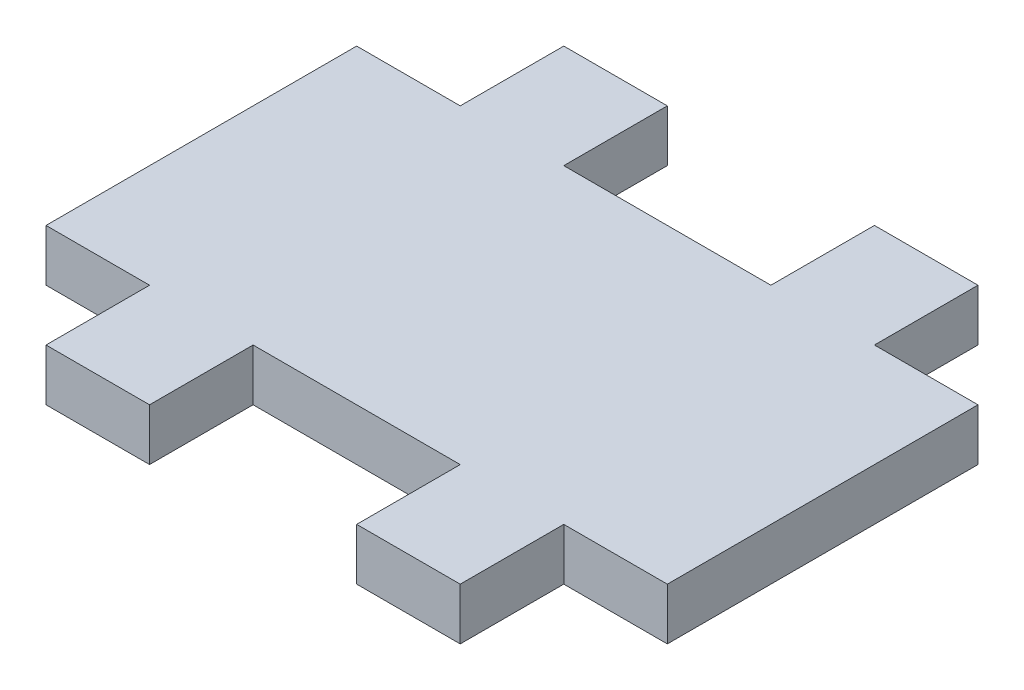
ISO-10303-21;
HEADER;
FILE_DESCRIPTION(('STEP AP214'),'2;1');
FILE_NAME('part.step','',(''),(''),'','','');
FILE_SCHEMA(('AUTOMOTIVE_DESIGN { 1 0 10303 214 1 1 1 1 }'));
ENDSEC;
DATA;
#1=APPLICATION_CONTEXT('core data for automotive mechanical design processes');
#2=APPLICATION_PROTOCOL_DEFINITION('international standard','automotive_design',2000,#1);
#3=PRODUCT_CONTEXT('',#1,'mechanical');
#4=PRODUCT('Part','Part','',(#3));
#5=PRODUCT_RELATED_PRODUCT_CATEGORY('part','',(#4));
#6=PRODUCT_DEFINITION_FORMATION('','',#4);
#7=PRODUCT_DEFINITION_CONTEXT('part definition',#1,'design');
#8=PRODUCT_DEFINITION('design','',#6,#7);
#9=PRODUCT_DEFINITION_SHAPE('','',#8);
#10=(LENGTH_UNIT() NAMED_UNIT(*) SI_UNIT(.MILLI.,.METRE.));
#11=(NAMED_UNIT(*) PLANE_ANGLE_UNIT() SI_UNIT($,.RADIAN.));
#12=(NAMED_UNIT(*) SI_UNIT($,.STERADIAN.) SOLID_ANGLE_UNIT());
#13=UNCERTAINTY_MEASURE_WITH_UNIT(LENGTH_MEASURE(1.E-05),#10,'distance_accuracy_value','');
#14=(GEOMETRIC_REPRESENTATION_CONTEXT(3) GLOBAL_UNCERTAINTY_ASSIGNED_CONTEXT((#13)) GLOBAL_UNIT_ASSIGNED_CONTEXT((#10,
#11,#12)) REPRESENTATION_CONTEXT('',''));
#15=CARTESIAN_POINT('',(0.,0.,0.));
#16=DIRECTION('',(0.,0.,1.));
#17=DIRECTION('',(1.,0.,0.));
#18=AXIS2_PLACEMENT_3D('',#15,#16,#17);
#19=CARTESIAN_POINT('',(0.,0.,0.));
#20=DIRECTION('',(0.,0.,1.));
#21=DIRECTION('',(1.,0.,0.));
#22=AXIS2_PLACEMENT_3D('',#19,#20,#21);
#23=PLANE('',#22);
#24=DIRECTION('',(0.,1.,0.));
#25=VECTOR('',#24,1.);
#26=CARTESIAN_POINT('',(-85.923135705541,251.012588459737,0.));
#27=LINE('',#26,#25);
#28=CARTESIAN_POINT('',(-85.923135705541,251.012588459737,0.));
#29=VERTEX_POINT('',#28);
#30=CARTESIAN_POINT('',(-85.923135705541,254.187588459737,0.));
#31=VERTEX_POINT('',#30);
#32=EDGE_CURVE('E291',#29,#31,#27,.T.);
#33=ORIENTED_EDGE('',*,*,#32,.T.);
#34=DIRECTION('',(1.,0.,0.));
#35=VECTOR('',#34,1.);
#36=CARTESIAN_POINT('',(-98.6231357055409,254.187588459737,0.));
#37=LINE('',#36,#35);
#38=CARTESIAN_POINT('',(-92.273135705541,254.187588459737,0.));
#39=VERTEX_POINT('',#38);
#40=EDGE_CURVE('E41',#39,#31,#37,.T.);
#41=ORIENTED_EDGE('',*,*,#40,.F.);
#42=DIRECTION('',(0.,1.,0.));
#43=VECTOR('',#42,1.);
#44=CARTESIAN_POINT('',(-92.273135705541,251.012588459737,0.));
#45=LINE('',#44,#43);
#46=CARTESIAN_POINT('',(-92.273135705541,251.012588459737,0.));
#47=VERTEX_POINT('',#46);
#48=EDGE_CURVE('E273',#47,#39,#45,.T.);
#49=ORIENTED_EDGE('',*,*,#48,.F.);
#50=DIRECTION('',(1.,0.,0.));
#51=VECTOR('',#50,1.);
#52=CARTESIAN_POINT('',(-98.623135705541,251.012588459737,0.));
#53=LINE('',#52,#51);
#54=EDGE_CURVE('E209',#47,#29,#53,.T.);
#55=ORIENTED_EDGE('',*,*,#54,.T.);
#56=EDGE_LOOP('',(#33,#41,#49,#55));
#57=FACE_BOUND('',#56,.T.);
#58=ADVANCED_FACE('F33',(#57),#23,.T.);
#59=CARTESIAN_POINT('',(-103.338027454324,247.978514454164,-31.7499999999999));
#60=DIRECTION('',(0.,0.,-1.));
#61=DIRECTION('',(-1.,0.,0.));
#62=AXIS2_PLACEMENT_3D('',#59,#60,#61);
#63=PLANE('',#62);
#64=DIRECTION('',(0.,1.,0.));
#65=VECTOR('',#64,1.);
#66=CARTESIAN_POINT('',(-85.923135705541,251.012588459737,-31.7499999999999));
#67=LINE('',#66,#65);
#68=CARTESIAN_POINT('',(-85.923135705541,251.012588459737,-31.7499999999999));
#69=VERTEX_POINT('',#68);
#70=CARTESIAN_POINT('',(-85.923135705541,254.187588459737,-31.7499999999999));
#71=VERTEX_POINT('',#70);
#72=EDGE_CURVE('E228',#69,#71,#67,.T.);
#73=ORIENTED_EDGE('',*,*,#72,.F.);
#74=DIRECTION('',(1.,0.,0.));
#75=VECTOR('',#74,1.);
#76=CARTESIAN_POINT('',(-98.623135705541,251.012588459737,-31.7499999999999));
#77=LINE('',#76,#75);
#78=CARTESIAN_POINT('',(-92.273135705541,251.012588459737,-31.7499999999999));
#79=VERTEX_POINT('',#78);
#80=EDGE_CURVE('E194',#79,#69,#77,.T.);
#81=ORIENTED_EDGE('',*,*,#80,.F.);
#82=DIRECTION('',(0.,1.,0.));
#83=VECTOR('',#82,1.);
#84=CARTESIAN_POINT('',(-92.273135705541,251.012588459737,-31.7499999999999));
#85=LINE('',#84,#83);
#86=CARTESIAN_POINT('',(-92.273135705541,254.187588459737,-31.7499999999999));
#87=VERTEX_POINT('',#86);
#88=EDGE_CURVE('E219',#79,#87,#85,.T.);
#89=ORIENTED_EDGE('',*,*,#88,.T.);
#90=DIRECTION('',(1.,0.,0.));
#91=VECTOR('',#90,1.);
#92=CARTESIAN_POINT('',(-98.623135705541,254.187588459737,-31.7499999999999));
#93=LINE('',#92,#91);
#94=EDGE_CURVE('E204',#87,#71,#93,.T.);
#95=ORIENTED_EDGE('',*,*,#94,.T.);
#96=EDGE_LOOP('',(#73,#81,#89,#95));
#97=FACE_BOUND('',#96,.T.);
#98=ADVANCED_FACE('F366',(#97),#63,.T.);
#99=DIRECTION('',(0.,1.,0.));
#100=VECTOR('',#99,1.);
#101=CARTESIAN_POINT('',(-66.8731357055409,251.012588459737,-31.7499999999999));
#102=LINE('',#101,#100);
#103=CARTESIAN_POINT('',(-66.8731357055409,251.012588459737,-31.7499999999999));
#104=VERTEX_POINT('',#103);
#105=CARTESIAN_POINT('',(-66.8731357055409,254.187588459737,-31.7499999999999));
#106=VERTEX_POINT('',#105);
#107=EDGE_CURVE('E259',#104,#106,#102,.T.);
#108=ORIENTED_EDGE('',*,*,#107,.F.);
#109=CARTESIAN_POINT('',(-73.2231357055409,251.012588459737,-31.7499999999999));
#110=VERTEX_POINT('',#109);
#111=EDGE_CURVE('E198',#110,#104,#77,.T.);
#112=ORIENTED_EDGE('',*,*,#111,.F.);
#113=DIRECTION('',(0.,1.,0.));
#114=VECTOR('',#113,1.);
#115=CARTESIAN_POINT('',(-73.2231357055409,251.012588459737,-31.7499999999999));
#116=LINE('',#115,#114);
#117=CARTESIAN_POINT('',(-73.2231357055409,254.187588459737,-31.7499999999999));
#118=VERTEX_POINT('',#117);
#119=EDGE_CURVE('E239',#110,#118,#116,.T.);
#120=ORIENTED_EDGE('',*,*,#119,.T.);
#121=EDGE_CURVE('E207',#118,#106,#93,.T.);
#122=ORIENTED_EDGE('',*,*,#121,.T.);
#123=EDGE_LOOP('',(#108,#112,#120,#122));
#124=FACE_BOUND('',#123,.T.);
#125=ADVANCED_FACE('F35',(#124),#63,.T.);
#126=DIRECTION('',(0.,1.,0.));
#127=VECTOR('',#126,1.);
#128=CARTESIAN_POINT('',(-66.8731357055409,251.012588459737,0.));
#129=LINE('',#128,#127);
#130=CARTESIAN_POINT('',(-66.8731357055409,251.012588459737,0.));
#131=VERTEX_POINT('',#130);
#132=CARTESIAN_POINT('',(-66.8731357055409,254.187588459737,0.));
#133=VERTEX_POINT('',#132);
#134=EDGE_CURVE('E307',#131,#133,#129,.T.);
#135=ORIENTED_EDGE('',*,*,#134,.T.);
#136=CARTESIAN_POINT('',(-73.223135705541,254.187588459737,0.));
#137=VERTEX_POINT('',#136);
#138=EDGE_CURVE('E203',#137,#133,#37,.T.);
#139=ORIENTED_EDGE('',*,*,#138,.F.);
#140=DIRECTION('',(0.,1.,0.));
#141=VECTOR('',#140,1.);
#142=CARTESIAN_POINT('',(-73.2231357055409,251.012588459737,0.));
#143=LINE('',#142,#141);
#144=CARTESIAN_POINT('',(-73.2231357055409,251.012588459737,0.));
#145=VERTEX_POINT('',#144);
#146=EDGE_CURVE('E56',#145,#137,#143,.T.);
#147=ORIENTED_EDGE('',*,*,#146,.F.);
#148=EDGE_CURVE('E206',#145,#131,#53,.T.);
#149=ORIENTED_EDGE('',*,*,#148,.T.);
#150=EDGE_LOOP('',(#135,#139,#147,#149));
#151=FACE_BOUND('',#150,.T.);
#152=ADVANCED_FACE('F325',(#151),#23,.T.);
#153=CARTESIAN_POINT('',(-98.623135705541,251.012588459737,-69.9820627876655));
#154=DIRECTION('',(0.,-1.,0.));
#155=DIRECTION('',(0.,0.,-1.));
#156=AXIS2_PLACEMENT_3D('',#153,#154,#155);
#157=PLANE('',#156);
#158=DIRECTION('',(0.,0.,1.));
#159=VECTOR('',#158,1.);
#160=CARTESIAN_POINT('',(-66.8731357055409,251.012588459737,0.));
#161=LINE('',#160,#159);
#162=CARTESIAN_POINT('',(-66.8731357055409,251.012588459737,-6.34999999999406));
#163=VERTEX_POINT('',#162);
#164=EDGE_CURVE('E177',#163,#131,#161,.T.);
#165=ORIENTED_EDGE('',*,*,#164,.T.);
#166=ORIENTED_EDGE('',*,*,#148,.F.);
#167=DIRECTION('',(0.,0.,-1.));
#168=VECTOR('',#167,1.);
#169=CARTESIAN_POINT('',(-73.2231357055409,251.012588459737,0.));
#170=LINE('',#169,#168);
#171=CARTESIAN_POINT('',(-73.2231357055409,251.012588459737,-6.34999999999406));
#172=VERTEX_POINT('',#171);
#173=EDGE_CURVE('E310',#145,#172,#170,.T.);
#174=ORIENTED_EDGE('',*,*,#173,.T.);
#175=DIRECTION('',(-1.,0.,0.));
#176=VECTOR('',#175,1.);
#177=CARTESIAN_POINT('',(-85.923135705541,251.012588459737,-6.34999999999406));
#178=LINE('',#177,#176);
#179=CARTESIAN_POINT('',(-85.923135705541,251.012588459737,-6.34999999999406));
#180=VERTEX_POINT('',#179);
#181=EDGE_CURVE('E294',#172,#180,#178,.T.);
#182=ORIENTED_EDGE('',*,*,#181,.T.);
#183=DIRECTION('',(0.,0.,1.));
#184=VECTOR('',#183,1.);
#185=CARTESIAN_POINT('',(-85.923135705541,251.012588459737,0.));
#186=LINE('',#185,#184);
#187=EDGE_CURVE('E302',#180,#29,#186,.T.);
#188=ORIENTED_EDGE('',*,*,#187,.T.);
#189=ORIENTED_EDGE('',*,*,#54,.F.);
#190=DIRECTION('',(0.,0.,-1.));
#191=VECTOR('',#190,1.);
#192=CARTESIAN_POINT('',(-92.273135705541,251.012588459737,0.));
#193=LINE('',#192,#191);
#194=CARTESIAN_POINT('',(-92.273135705541,251.012588459737,-6.34999999999406));
#195=VERTEX_POINT('',#194);
#196=EDGE_CURVE('E282',#47,#195,#193,.T.);
#197=ORIENTED_EDGE('',*,*,#196,.T.);
#198=DIRECTION('',(-1.,0.,0.));
#199=VECTOR('',#198,1.);
#200=CARTESIAN_POINT('',(-98.6231357055409,251.012588459737,-6.34999999999406));
#201=LINE('',#200,#199);
#202=CARTESIAN_POINT('',(-98.6231357055409,251.012588459737,-6.34999999999406));
#203=VERTEX_POINT('',#202);
#204=EDGE_CURVE('E276',#195,#203,#201,.T.);
#205=ORIENTED_EDGE('',*,*,#204,.T.);
#206=DIRECTION('',(0.,0.,1.));
#207=VECTOR('',#206,1.);
#208=CARTESIAN_POINT('',(-98.623135705541,251.012588459737,-69.9820627876655));
#209=LINE('',#208,#207);
#210=CARTESIAN_POINT('',(-98.623135705541,251.012588459737,-25.3999999999999));
#211=VERTEX_POINT('',#210);
#212=EDGE_CURVE('E11',#211,#203,#209,.T.);
#213=ORIENTED_EDGE('',*,*,#212,.F.);
#214=DIRECTION('',(1.,0.,0.));
#215=VECTOR('',#214,1.);
#216=CARTESIAN_POINT('',(-98.6231357055409,251.012588459737,-25.3999999999999));
#217=LINE('',#216,#215);
#218=CARTESIAN_POINT('',(-92.273135705541,251.012588459737,-25.3999999999999));
#219=VERTEX_POINT('',#218);
#220=EDGE_CURVE('E224',#211,#219,#217,.T.);
#221=ORIENTED_EDGE('',*,*,#220,.T.);
#222=DIRECTION('',(0.,0.,-1.));
#223=VECTOR('',#222,1.);
#224=CARTESIAN_POINT('',(-92.273135705541,251.012588459737,-31.7499999999999));
#225=LINE('',#224,#223);
#226=EDGE_CURVE('E217',#219,#79,#225,.T.);
#227=ORIENTED_EDGE('',*,*,#226,.T.);
#228=ORIENTED_EDGE('',*,*,#80,.T.);
#229=DIRECTION('',(0.,0.,1.));
#230=VECTOR('',#229,1.);
#231=CARTESIAN_POINT('',(-85.923135705541,251.012588459737,-31.7499999999999));
#232=LINE('',#231,#230);
#233=CARTESIAN_POINT('',(-85.923135705541,251.012588459737,-25.3999999999999));
#234=VERTEX_POINT('',#233);
#235=EDGE_CURVE('E245',#69,#234,#232,.T.);
#236=ORIENTED_EDGE('',*,*,#235,.T.);
#237=DIRECTION('',(1.,0.,0.));
#238=VECTOR('',#237,1.);
#239=CARTESIAN_POINT('',(-85.923135705541,251.012588459737,-25.3999999999999));
#240=LINE('',#239,#238);
#241=CARTESIAN_POINT('',(-73.2231357055409,251.012588459737,-25.3999999999999));
#242=VERTEX_POINT('',#241);
#243=EDGE_CURVE('E254',#234,#242,#240,.T.);
#244=ORIENTED_EDGE('',*,*,#243,.T.);
#245=DIRECTION('',(0.,0.,-1.));
#246=VECTOR('',#245,1.);
#247=CARTESIAN_POINT('',(-73.2231357055409,251.012588459737,-31.7499999999999));
#248=LINE('',#247,#246);
#249=EDGE_CURVE('E237',#242,#110,#248,.T.);
#250=ORIENTED_EDGE('',*,*,#249,.T.);
#251=ORIENTED_EDGE('',*,*,#111,.T.);
#252=DIRECTION('',(0.,0.,1.));
#253=VECTOR('',#252,1.);
#254=CARTESIAN_POINT('',(-66.8731357055409,251.012588459737,-31.7499999999999));
#255=LINE('',#254,#253);
#256=CARTESIAN_POINT('',(-66.8731357055409,251.012588459737,-25.3999999999999));
#257=VERTEX_POINT('',#256);
#258=EDGE_CURVE('E266',#104,#257,#255,.T.);
#259=ORIENTED_EDGE('',*,*,#258,.T.);
#260=DIRECTION('',(1.,0.,0.));
#261=VECTOR('',#260,1.);
#262=CARTESIAN_POINT('',(-60.5231357055409,251.012588459737,-25.3999999999999));
#263=LINE('',#262,#261);
#264=CARTESIAN_POINT('',(-60.5231357055409,251.012588459737,-25.3999999999999));
#265=VERTEX_POINT('',#264);
#266=EDGE_CURVE('E193',#257,#265,#263,.T.);
#267=ORIENTED_EDGE('',*,*,#266,.T.);
#268=DIRECTION('',(0.,0.,1.));
#269=VECTOR('',#268,1.);
#270=CARTESIAN_POINT('',(-60.5231357055409,251.012588459737,-69.9820627876655));
#271=LINE('',#270,#269);
#272=CARTESIAN_POINT('',(-60.5231357055409,251.012588459737,-6.34999999999406));
#273=VERTEX_POINT('',#272);
#274=EDGE_CURVE('E185',#265,#273,#271,.T.);
#275=ORIENTED_EDGE('',*,*,#274,.T.);
#276=DIRECTION('',(-1.,0.,0.));
#277=VECTOR('',#276,1.);
#278=CARTESIAN_POINT('',(-60.5231357055409,251.012588459737,-6.34999999999406));
#279=LINE('',#278,#277);
#280=EDGE_CURVE('E170',#273,#163,#279,.T.);
#281=ORIENTED_EDGE('',*,*,#280,.T.);
#282=EDGE_LOOP('',(#165,#166,#174,#182,#188,#189,#197,#205,#213,#221,#227,#228,#236,#244,#250,
#251,#259,#267,#275,#281));
#283=FACE_BOUND('',#282,.T.);
#284=ADVANCED_FACE('F190',(#283),#157,.T.);
#285=CARTESIAN_POINT('',(-60.5231357055409,254.187588459737,-69.9820627876655));
#286=DIRECTION('',(-1.,0.,0.));
#287=DIRECTION('',(0.,0.,1.));
#288=AXIS2_PLACEMENT_3D('',#285,#286,#287);
#289=PLANE('',#288);
#290=DIRECTION('',(0.,0.,1.));
#291=VECTOR('',#290,1.);
#292=CARTESIAN_POINT('',(-60.5231357055409,254.187588459737,-69.9820627876655));
#293=LINE('',#292,#291);
#294=CARTESIAN_POINT('',(-60.5231357055409,254.187588459737,-25.3999999999999));
#295=VERTEX_POINT('',#294);
#296=CARTESIAN_POINT('',(-60.5231357055409,254.187588459737,-6.34999999999407));
#297=VERTEX_POINT('',#296);
#298=EDGE_CURVE('E187',#295,#297,#293,.T.);
#299=ORIENTED_EDGE('',*,*,#298,.T.);
#300=DIRECTION('',(0.,1.,0.));
#301=VECTOR('',#300,1.);
#302=CARTESIAN_POINT('',(-60.5231357055409,251.012588459737,-6.34999999999406));
#303=LINE('',#302,#301);
#304=EDGE_CURVE('E48',#273,#297,#303,.T.);
#305=ORIENTED_EDGE('',*,*,#304,.F.);
#306=ORIENTED_EDGE('',*,*,#274,.F.);
#307=DIRECTION('',(0.,1.,0.));
#308=VECTOR('',#307,1.);
#309=CARTESIAN_POINT('',(-60.5231357055409,251.012588459737,-25.3999999999999));
#310=LINE('',#309,#308);
#311=EDGE_CURVE('E251',#265,#295,#310,.T.);
#312=ORIENTED_EDGE('',*,*,#311,.T.);
#313=EDGE_LOOP('',(#299,#305,#306,#312));
#314=FACE_BOUND('',#313,.T.);
#315=ADVANCED_FACE('F183',(#314),#289,.F.);
#316=CARTESIAN_POINT('',(-98.6231357055409,254.187588459737,-69.9820627876655));
#317=DIRECTION('',(0.,-1.,0.));
#318=DIRECTION('',(0.,0.,-1.));
#319=AXIS2_PLACEMENT_3D('',#316,#317,#318);
#320=PLANE('',#319);
#321=ORIENTED_EDGE('',*,*,#138,.T.);
#322=DIRECTION('',(0.,0.,1.));
#323=VECTOR('',#322,1.);
#324=CARTESIAN_POINT('',(-66.8731357055409,254.187588459737,0.));
#325=LINE('',#324,#323);
#326=CARTESIAN_POINT('',(-66.8731357055409,254.187588459737,-6.34999999999406));
#327=VERTEX_POINT('',#326);
#328=EDGE_CURVE('E178',#327,#133,#325,.T.);
#329=ORIENTED_EDGE('',*,*,#328,.F.);
#330=DIRECTION('',(-1.,0.,0.));
#331=VECTOR('',#330,1.);
#332=CARTESIAN_POINT('',(-60.5231357055409,254.187588459737,-6.34999999999406));
#333=LINE('',#332,#331);
#334=EDGE_CURVE('E319',#297,#327,#333,.T.);
#335=ORIENTED_EDGE('',*,*,#334,.F.);
#336=ORIENTED_EDGE('',*,*,#298,.F.);
#337=DIRECTION('',(1.,0.,0.));
#338=VECTOR('',#337,1.);
#339=CARTESIAN_POINT('',(-60.5231357055409,254.187588459737,-25.3999999999999));
#340=LINE('',#339,#338);
#341=CARTESIAN_POINT('',(-66.8731357055409,254.187588459737,-25.3999999999999));
#342=VERTEX_POINT('',#341);
#343=EDGE_CURVE('E264',#342,#295,#340,.T.);
#344=ORIENTED_EDGE('',*,*,#343,.F.);
#345=DIRECTION('',(0.,0.,1.));
#346=VECTOR('',#345,1.);
#347=CARTESIAN_POINT('',(-66.8731357055409,254.187588459737,-31.7499999999999));
#348=LINE('',#347,#346);
#349=EDGE_CURVE('E267',#106,#342,#348,.T.);
#350=ORIENTED_EDGE('',*,*,#349,.F.);
#351=ORIENTED_EDGE('',*,*,#121,.F.);
#352=DIRECTION('',(0.,0.,-1.));
#353=VECTOR('',#352,1.);
#354=CARTESIAN_POINT('',(-73.2231357055409,254.187588459737,-31.7499999999999));
#355=LINE('',#354,#353);
#356=CARTESIAN_POINT('',(-73.2231357055409,254.187588459737,-25.3999999999999));
#357=VERTEX_POINT('',#356);
#358=EDGE_CURVE('E243',#357,#118,#355,.T.);
#359=ORIENTED_EDGE('',*,*,#358,.F.);
#360=DIRECTION('',(1.,0.,0.));
#361=VECTOR('',#360,1.);
#362=CARTESIAN_POINT('',(-85.923135705541,254.187588459737,-25.3999999999999));
#363=LINE('',#362,#361);
#364=CARTESIAN_POINT('',(-85.923135705541,254.187588459737,-25.3999999999999));
#365=VERTEX_POINT('',#364);
#366=EDGE_CURVE('E246',#365,#357,#363,.T.);
#367=ORIENTED_EDGE('',*,*,#366,.F.);
#368=DIRECTION('',(0.,0.,1.));
#369=VECTOR('',#368,1.);
#370=CARTESIAN_POINT('',(-85.923135705541,254.187588459737,-31.7499999999999));
#371=LINE('',#370,#369);
#372=EDGE_CURVE('E249',#71,#365,#371,.T.);
#373=ORIENTED_EDGE('',*,*,#372,.F.);
#374=ORIENTED_EDGE('',*,*,#94,.F.);
#375=DIRECTION('',(0.,0.,-1.));
#376=VECTOR('',#375,1.);
#377=CARTESIAN_POINT('',(-92.273135705541,254.187588459737,-31.7499999999999));
#378=LINE('',#377,#376);
#379=CARTESIAN_POINT('',(-92.273135705541,254.187588459737,-25.3999999999999));
#380=VERTEX_POINT('',#379);
#381=EDGE_CURVE('E222',#380,#87,#378,.T.);
#382=ORIENTED_EDGE('',*,*,#381,.F.);
#383=DIRECTION('',(1.,0.,0.));
#384=VECTOR('',#383,1.);
#385=CARTESIAN_POINT('',(-98.6231357055409,254.187588459737,-25.3999999999999));
#386=LINE('',#385,#384);
#387=CARTESIAN_POINT('',(-98.6231357055409,254.187588459737,-25.3999999999999));
#388=VERTEX_POINT('',#387);
#389=EDGE_CURVE('E225',#388,#380,#386,.T.);
#390=ORIENTED_EDGE('',*,*,#389,.F.);
#391=DIRECTION('',(0.,0.,1.));
#392=VECTOR('',#391,1.);
#393=CARTESIAN_POINT('',(-98.6231357055409,254.187588459737,-69.9820627876655));
#394=LINE('',#393,#392);
#395=CARTESIAN_POINT('',(-98.6231357055409,254.187588459737,-6.34999999999407));
#396=VERTEX_POINT('',#395);
#397=EDGE_CURVE('E195',#388,#396,#394,.T.);
#398=ORIENTED_EDGE('',*,*,#397,.T.);
#399=DIRECTION('',(-1.,0.,0.));
#400=VECTOR('',#399,1.);
#401=CARTESIAN_POINT('',(-98.6231357055409,254.187588459737,-6.34999999999406));
#402=LINE('',#401,#400);
#403=CARTESIAN_POINT('',(-92.273135705541,254.187588459737,-6.34999999999406));
#404=VERTEX_POINT('',#403);
#405=EDGE_CURVE('E280',#404,#396,#402,.T.);
#406=ORIENTED_EDGE('',*,*,#405,.F.);
#407=DIRECTION('',(0.,0.,-1.));
#408=VECTOR('',#407,1.);
#409=CARTESIAN_POINT('',(-92.273135705541,254.187588459737,0.));
#410=LINE('',#409,#408);
#411=EDGE_CURVE('E283',#39,#404,#410,.T.);
#412=ORIENTED_EDGE('',*,*,#411,.F.);
#413=ORIENTED_EDGE('',*,*,#40,.T.);
#414=DIRECTION('',(0.,0.,1.));
#415=VECTOR('',#414,1.);
#416=CARTESIAN_POINT('',(-85.923135705541,254.187588459737,0.));
#417=LINE('',#416,#415);
#418=CARTESIAN_POINT('',(-85.923135705541,254.187588459737,-6.34999999999406));
#419=VERTEX_POINT('',#418);
#420=EDGE_CURVE('E305',#419,#31,#417,.T.);
#421=ORIENTED_EDGE('',*,*,#420,.F.);
#422=DIRECTION('',(-1.,0.,0.));
#423=VECTOR('',#422,1.);
#424=CARTESIAN_POINT('',(-85.923135705541,254.187588459737,-6.34999999999406));
#425=LINE('',#424,#423);
#426=CARTESIAN_POINT('',(-73.2231357055409,254.187588459737,-6.34999999999406));
#427=VERTEX_POINT('',#426);
#428=EDGE_CURVE('E299',#427,#419,#425,.T.);
#429=ORIENTED_EDGE('',*,*,#428,.F.);
#430=DIRECTION('',(0.,0.,-1.));
#431=VECTOR('',#430,1.);
#432=CARTESIAN_POINT('',(-73.2231357055409,254.187588459737,0.));
#433=LINE('',#432,#431);
#434=EDGE_CURVE('E303',#137,#427,#433,.T.);
#435=ORIENTED_EDGE('',*,*,#434,.F.);
#436=EDGE_LOOP('',(#321,#329,#335,#336,#344,#350,#351,#359,#367,#373,#374,#382,#390,#398,#406,
#412,#413,#421,#429,#435));
#437=FACE_BOUND('',#436,.T.);
#438=ADVANCED_FACE('F330',(#437),#320,.F.);
#439=CARTESIAN_POINT('',(-98.6231357055409,254.187588459737,-69.9820627876655));
#440=DIRECTION('',(-1.,0.,0.));
#441=DIRECTION('',(0.,-1.,0.));
#442=AXIS2_PLACEMENT_3D('',#439,#440,#441);
#443=PLANE('',#442);
#444=DIRECTION('',(0.,1.,0.));
#445=VECTOR('',#444,1.);
#446=CARTESIAN_POINT('',(-98.6231357055409,251.012588459737,-6.34999999999406));
#447=LINE('',#446,#445);
#448=EDGE_CURVE('E270',#203,#396,#447,.T.);
#449=ORIENTED_EDGE('',*,*,#448,.T.);
#450=ORIENTED_EDGE('',*,*,#397,.F.);
#451=DIRECTION('',(0.,1.,0.));
#452=VECTOR('',#451,1.);
#453=CARTESIAN_POINT('',(-98.6231357055409,251.012588459737,-25.3999999999999));
#454=LINE('',#453,#452);
#455=EDGE_CURVE('E214',#211,#388,#454,.T.);
#456=ORIENTED_EDGE('',*,*,#455,.F.);
#457=ORIENTED_EDGE('',*,*,#212,.T.);
#458=EDGE_LOOP('',(#449,#450,#456,#457));
#459=FACE_BOUND('',#458,.T.);
#460=ADVANCED_FACE('F353',(#459),#443,.T.);
#461=CARTESIAN_POINT('',(-92.273135705541,251.012588459737,-31.7499999999999));
#462=DIRECTION('',(1.,0.,0.));
#463=DIRECTION('',(0.,0.,-1.));
#464=AXIS2_PLACEMENT_3D('',#461,#462,#463);
#465=PLANE('',#464);
#466=ORIENTED_EDGE('',*,*,#381,.T.);
#467=ORIENTED_EDGE('',*,*,#88,.F.);
#468=ORIENTED_EDGE('',*,*,#226,.F.);
#469=DIRECTION('',(0.,1.,0.));
#470=VECTOR('',#469,1.);
#471=CARTESIAN_POINT('',(-92.273135705541,251.012588459737,-25.3999999999999));
#472=LINE('',#471,#470);
#473=EDGE_CURVE('E216',#219,#380,#472,.T.);
#474=ORIENTED_EDGE('',*,*,#473,.T.);
#475=EDGE_LOOP('',(#466,#467,#468,#474));
#476=FACE_BOUND('',#475,.T.);
#477=ADVANCED_FACE('F362',(#476),#465,.F.);
#478=CARTESIAN_POINT('',(-98.6231357055409,251.012588459737,-25.3999999999999));
#479=DIRECTION('',(0.,0.,1.));
#480=DIRECTION('',(1.,0.,0.));
#481=AXIS2_PLACEMENT_3D('',#478,#479,#480);
#482=PLANE('',#481);
#483=ORIENTED_EDGE('',*,*,#389,.T.);
#484=ORIENTED_EDGE('',*,*,#473,.F.);
#485=ORIENTED_EDGE('',*,*,#220,.F.);
#486=ORIENTED_EDGE('',*,*,#455,.T.);
#487=EDGE_LOOP('',(#483,#484,#485,#486));
#488=FACE_BOUND('',#487,.T.);
#489=ADVANCED_FACE('F359',(#488),#482,.F.);
#490=CARTESIAN_POINT('',(-85.923135705541,251.012588459737,-31.7499999999999));
#491=DIRECTION('',(-1.,0.,0.));
#492=DIRECTION('',(0.,0.,1.));
#493=AXIS2_PLACEMENT_3D('',#490,#491,#492);
#494=PLANE('',#493);
#495=ORIENTED_EDGE('',*,*,#372,.T.);
#496=DIRECTION('',(0.,1.,0.));
#497=VECTOR('',#496,1.);
#498=CARTESIAN_POINT('',(-85.923135705541,251.012588459737,-25.3999999999999));
#499=LINE('',#498,#497);
#500=EDGE_CURVE('E233',#234,#365,#499,.T.);
#501=ORIENTED_EDGE('',*,*,#500,.F.);
#502=ORIENTED_EDGE('',*,*,#235,.F.);
#503=ORIENTED_EDGE('',*,*,#72,.T.);
#504=EDGE_LOOP('',(#495,#501,#502,#503));
#505=FACE_BOUND('',#504,.T.);
#506=ADVANCED_FACE('F371',(#505),#494,.F.);
#507=CARTESIAN_POINT('',(-73.2231357055409,251.012588459737,-31.7499999999999));
#508=DIRECTION('',(1.,0.,0.));
#509=DIRECTION('',(0.,0.,-1.));
#510=AXIS2_PLACEMENT_3D('',#507,#508,#509);
#511=PLANE('',#510);
#512=ORIENTED_EDGE('',*,*,#358,.T.);
#513=ORIENTED_EDGE('',*,*,#119,.F.);
#514=ORIENTED_EDGE('',*,*,#249,.F.);
#515=DIRECTION('',(0.,1.,0.));
#516=VECTOR('',#515,1.);
#517=CARTESIAN_POINT('',(-73.2231357055409,251.012588459737,-25.3999999999999));
#518=LINE('',#517,#516);
#519=EDGE_CURVE('E236',#242,#357,#518,.T.);
#520=ORIENTED_EDGE('',*,*,#519,.T.);
#521=EDGE_LOOP('',(#512,#513,#514,#520));
#522=FACE_BOUND('',#521,.T.);
#523=ADVANCED_FACE('F396',(#522),#511,.F.);
#524=CARTESIAN_POINT('',(-85.923135705541,251.012588459737,-25.3999999999999));
#525=DIRECTION('',(0.,0.,1.));
#526=DIRECTION('',(1.,0.,0.));
#527=AXIS2_PLACEMENT_3D('',#524,#525,#526);
#528=PLANE('',#527);
#529=ORIENTED_EDGE('',*,*,#366,.T.);
#530=ORIENTED_EDGE('',*,*,#519,.F.);
#531=ORIENTED_EDGE('',*,*,#243,.F.);
#532=ORIENTED_EDGE('',*,*,#500,.T.);
#533=EDGE_LOOP('',(#529,#530,#531,#532));
#534=FACE_BOUND('',#533,.T.);
#535=ADVANCED_FACE('F374',(#534),#528,.F.);
#536=CARTESIAN_POINT('',(-60.5231357055409,251.012588459737,-25.3999999999999));
#537=DIRECTION('',(0.,0.,1.));
#538=DIRECTION('',(1.,0.,0.));
#539=AXIS2_PLACEMENT_3D('',#536,#537,#538);
#540=PLANE('',#539);
#541=ORIENTED_EDGE('',*,*,#343,.T.);
#542=ORIENTED_EDGE('',*,*,#311,.F.);
#543=ORIENTED_EDGE('',*,*,#266,.F.);
#544=DIRECTION('',(0.,1.,0.));
#545=VECTOR('',#544,1.);
#546=CARTESIAN_POINT('',(-66.8731357055409,251.012588459737,-25.3999999999999));
#547=LINE('',#546,#545);
#548=EDGE_CURVE('E261',#257,#342,#547,.T.);
#549=ORIENTED_EDGE('',*,*,#548,.T.);
#550=EDGE_LOOP('',(#541,#542,#543,#549));
#551=FACE_BOUND('',#550,.T.);
#552=ADVANCED_FACE('F388',(#551),#540,.F.);
#553=CARTESIAN_POINT('',(-66.8731357055409,251.012588459737,-31.7499999999999));
#554=DIRECTION('',(-1.,0.,0.));
#555=DIRECTION('',(0.,0.,1.));
#556=AXIS2_PLACEMENT_3D('',#553,#554,#555);
#557=PLANE('',#556);
#558=ORIENTED_EDGE('',*,*,#349,.T.);
#559=ORIENTED_EDGE('',*,*,#548,.F.);
#560=ORIENTED_EDGE('',*,*,#258,.F.);
#561=ORIENTED_EDGE('',*,*,#107,.T.);
#562=EDGE_LOOP('',(#558,#559,#560,#561));
#563=FACE_BOUND('',#562,.T.);
#564=ADVANCED_FACE('F385',(#563),#557,.F.);
#565=CARTESIAN_POINT('',(-98.6231357055409,251.012588459737,-6.34999999999406));
#566=DIRECTION('',(0.,0.,-1.));
#567=DIRECTION('',(-1.,0.,0.));
#568=AXIS2_PLACEMENT_3D('',#565,#566,#567);
#569=PLANE('',#568);
#570=ORIENTED_EDGE('',*,*,#405,.T.);
#571=ORIENTED_EDGE('',*,*,#448,.F.);
#572=ORIENTED_EDGE('',*,*,#204,.F.);
#573=DIRECTION('',(0.,1.,0.));
#574=VECTOR('',#573,1.);
#575=CARTESIAN_POINT('',(-92.273135705541,251.012588459737,-6.34999999999406));
#576=LINE('',#575,#574);
#577=EDGE_CURVE('E275',#195,#404,#576,.T.);
#578=ORIENTED_EDGE('',*,*,#577,.T.);
#579=EDGE_LOOP('',(#570,#571,#572,#578));
#580=FACE_BOUND('',#579,.T.);
#581=ADVANCED_FACE('F350',(#580),#569,.F.);
#582=CARTESIAN_POINT('',(-92.273135705541,251.012588459737,0.));
#583=DIRECTION('',(1.,0.,0.));
#584=DIRECTION('',(0.,0.,-1.));
#585=AXIS2_PLACEMENT_3D('',#582,#583,#584);
#586=PLANE('',#585);
#587=ORIENTED_EDGE('',*,*,#411,.T.);
#588=ORIENTED_EDGE('',*,*,#577,.F.);
#589=ORIENTED_EDGE('',*,*,#196,.F.);
#590=ORIENTED_EDGE('',*,*,#48,.T.);
#591=EDGE_LOOP('',(#587,#588,#589,#590));
#592=FACE_BOUND('',#591,.T.);
#593=ADVANCED_FACE('F345',(#592),#586,.F.);
#594=CARTESIAN_POINT('',(-85.923135705541,251.012588459737,0.));
#595=DIRECTION('',(-1.,0.,0.));
#596=DIRECTION('',(0.,0.,1.));
#597=AXIS2_PLACEMENT_3D('',#594,#595,#596);
#598=PLANE('',#597);
#599=ORIENTED_EDGE('',*,*,#420,.T.);
#600=ORIENTED_EDGE('',*,*,#32,.F.);
#601=ORIENTED_EDGE('',*,*,#187,.F.);
#602=DIRECTION('',(0.,1.,0.));
#603=VECTOR('',#602,1.);
#604=CARTESIAN_POINT('',(-85.923135705541,251.012588459737,-6.34999999999406));
#605=LINE('',#604,#603);
#606=EDGE_CURVE('E286',#180,#419,#605,.T.);
#607=ORIENTED_EDGE('',*,*,#606,.T.);
#608=EDGE_LOOP('',(#599,#600,#601,#607));
#609=FACE_BOUND('',#608,.T.);
#610=ADVANCED_FACE('F481',(#609),#598,.F.);
#611=CARTESIAN_POINT('',(-85.923135705541,251.012588459737,-6.34999999999406));
#612=DIRECTION('',(0.,0.,-1.));
#613=DIRECTION('',(-1.,0.,0.));
#614=AXIS2_PLACEMENT_3D('',#611,#612,#613);
#615=PLANE('',#614);
#616=ORIENTED_EDGE('',*,*,#428,.T.);
#617=ORIENTED_EDGE('',*,*,#606,.F.);
#618=ORIENTED_EDGE('',*,*,#181,.F.);
#619=DIRECTION('',(0.,1.,0.));
#620=VECTOR('',#619,1.);
#621=CARTESIAN_POINT('',(-73.2231357055409,251.012588459737,-6.34999999999406));
#622=LINE('',#621,#620);
#623=EDGE_CURVE('E296',#172,#427,#622,.T.);
#624=ORIENTED_EDGE('',*,*,#623,.T.);
#625=EDGE_LOOP('',(#616,#617,#618,#624));
#626=FACE_BOUND('',#625,.T.);
#627=ADVANCED_FACE('F336',(#626),#615,.F.);
#628=CARTESIAN_POINT('',(-73.2231357055409,251.012588459737,0.));
#629=DIRECTION('',(1.,0.,0.));
#630=DIRECTION('',(0.,0.,-1.));
#631=AXIS2_PLACEMENT_3D('',#628,#629,#630);
#632=PLANE('',#631);
#633=ORIENTED_EDGE('',*,*,#434,.T.);
#634=ORIENTED_EDGE('',*,*,#623,.F.);
#635=ORIENTED_EDGE('',*,*,#173,.F.);
#636=ORIENTED_EDGE('',*,*,#146,.T.);
#637=EDGE_LOOP('',(#633,#634,#635,#636));
#638=FACE_BOUND('',#637,.T.);
#639=ADVANCED_FACE('F333',(#638),#632,.F.);
#640=CARTESIAN_POINT('',(-66.8731357055409,251.012588459737,0.));
#641=DIRECTION('',(-1.,0.,0.));
#642=DIRECTION('',(0.,0.,1.));
#643=AXIS2_PLACEMENT_3D('',#640,#641,#642);
#644=PLANE('',#643);
#645=ORIENTED_EDGE('',*,*,#328,.T.);
#646=ORIENTED_EDGE('',*,*,#134,.F.);
#647=ORIENTED_EDGE('',*,*,#164,.F.);
#648=DIRECTION('',(0.,1.,0.));
#649=VECTOR('',#648,1.);
#650=CARTESIAN_POINT('',(-66.8731357055409,251.012588459737,-6.34999999999406));
#651=LINE('',#650,#649);
#652=EDGE_CURVE('E172',#163,#327,#651,.T.);
#653=ORIENTED_EDGE('',*,*,#652,.T.);
#654=EDGE_LOOP('',(#645,#646,#647,#653));
#655=FACE_BOUND('',#654,.T.);
#656=ADVANCED_FACE('F502',(#655),#644,.F.);
#657=CARTESIAN_POINT('',(-60.5231357055409,251.012588459737,-6.34999999999406));
#658=DIRECTION('',(0.,0.,-1.));
#659=DIRECTION('',(-1.,0.,0.));
#660=AXIS2_PLACEMENT_3D('',#657,#658,#659);
#661=PLANE('',#660);
#662=ORIENTED_EDGE('',*,*,#334,.T.);
#663=ORIENTED_EDGE('',*,*,#652,.F.);
#664=ORIENTED_EDGE('',*,*,#280,.F.);
#665=ORIENTED_EDGE('',*,*,#304,.T.);
#666=EDGE_LOOP('',(#662,#663,#664,#665));
#667=FACE_BOUND('',#666,.T.);
#668=ADVANCED_FACE('F171',(#667),#661,.F.);
#669=CLOSED_SHELL('',(#58,#98,#125,#152,#284,#315,#438,#460,#477,#489,#506,#523,#535,#552,#564,
#581,#593,#610,#627,#639,#656,#668));
#670=MANIFOLD_SOLID_BREP('B2',#669);
#671=ADVANCED_BREP_SHAPE_REPRESENTATION('',(#18,#670),#14);
#672=SHAPE_DEFINITION_REPRESENTATION(#9,#671);
ENDSEC;
END-ISO-10303-21;
